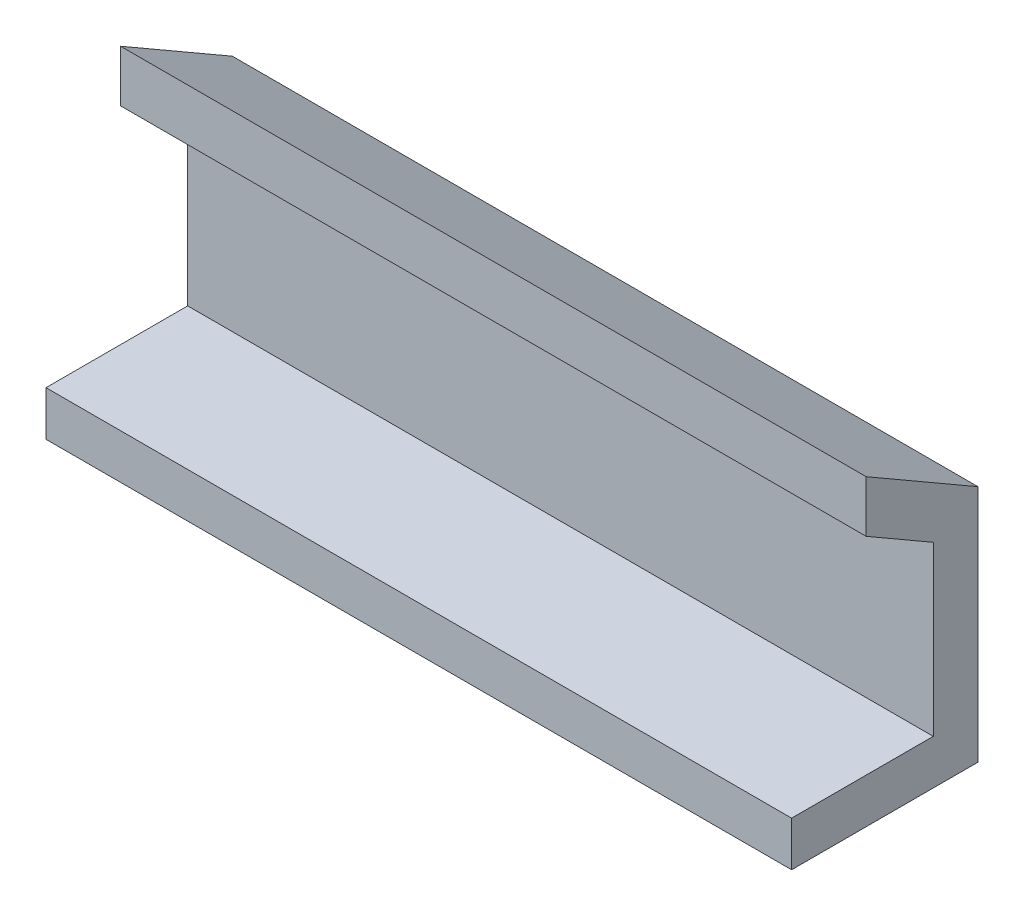
ISO-10303-21;
HEADER;
FILE_DESCRIPTION(('STEP AP214'),'2;1');
FILE_NAME('part.step','',(''),(''),'','','');
FILE_SCHEMA(('AUTOMOTIVE_DESIGN { 1 0 10303 214 1 1 1 1 }'));
ENDSEC;
DATA;
#1=APPLICATION_CONTEXT('core data for automotive mechanical design processes');
#2=APPLICATION_PROTOCOL_DEFINITION('international standard','automotive_design',2000,#1);
#3=PRODUCT_CONTEXT('',#1,'mechanical');
#4=PRODUCT('Part','Part','',(#3));
#5=PRODUCT_RELATED_PRODUCT_CATEGORY('part','',(#4));
#6=PRODUCT_DEFINITION_FORMATION('','',#4);
#7=PRODUCT_DEFINITION_CONTEXT('part definition',#1,'design');
#8=PRODUCT_DEFINITION('design','',#6,#7);
#9=PRODUCT_DEFINITION_SHAPE('','',#8);
#10=(LENGTH_UNIT() NAMED_UNIT(*) SI_UNIT(.MILLI.,.METRE.));
#11=(NAMED_UNIT(*) PLANE_ANGLE_UNIT() SI_UNIT($,.RADIAN.));
#12=(NAMED_UNIT(*) SI_UNIT($,.STERADIAN.) SOLID_ANGLE_UNIT());
#13=UNCERTAINTY_MEASURE_WITH_UNIT(LENGTH_MEASURE(1.E-05),#10,'distance_accuracy_value','');
#14=(GEOMETRIC_REPRESENTATION_CONTEXT(3) GLOBAL_UNCERTAINTY_ASSIGNED_CONTEXT((#13)) GLOBAL_UNIT_ASSIGNED_CONTEXT((#10,
#11,#12)) REPRESENTATION_CONTEXT('',''));
#15=CARTESIAN_POINT('',(0.,0.,0.));
#16=DIRECTION('',(0.,0.,1.));
#17=DIRECTION('',(1.,0.,0.));
#18=AXIS2_PLACEMENT_3D('',#15,#16,#17);
#19=CARTESIAN_POINT('',(100.,6.,0.));
#20=DIRECTION('',(0.,0.,-1.));
#21=DIRECTION('',(0.,1.,0.));
#22=AXIS2_PLACEMENT_3D('',#19,#20,#21);
#23=PLANE('',#22);
#24=DIRECTION('',(0.,-1.,0.));
#25=VECTOR('',#24,1.);
#26=CARTESIAN_POINT('',(0.,6.,0.));
#27=LINE('',#26,#25);
#28=CARTESIAN_POINT('',(0.,6.,0.));
#29=VERTEX_POINT('',#28);
#30=CARTESIAN_POINT('',(0.,0.,0.));
#31=VERTEX_POINT('',#30);
#32=EDGE_CURVE('E131',#29,#31,#27,.T.);
#33=ORIENTED_EDGE('',*,*,#32,.T.);
#34=DIRECTION('',(-1.,0.,0.));
#35=VECTOR('',#34,1.);
#36=CARTESIAN_POINT('',(100.,0.,0.));
#37=LINE('',#36,#35);
#38=CARTESIAN_POINT('',(100.,0.,0.));
#39=VERTEX_POINT('',#38);
#40=EDGE_CURVE('E11',#39,#31,#37,.T.);
#41=ORIENTED_EDGE('',*,*,#40,.F.);
#42=DIRECTION('',(0.,-1.,0.));
#43=VECTOR('',#42,1.);
#44=CARTESIAN_POINT('',(100.,6.,0.));
#45=LINE('',#44,#43);
#46=CARTESIAN_POINT('',(100.,6.,0.));
#47=VERTEX_POINT('',#46);
#48=EDGE_CURVE('E145',#47,#39,#45,.T.);
#49=ORIENTED_EDGE('',*,*,#48,.F.);
#50=DIRECTION('',(-1.,0.,0.));
#51=VECTOR('',#50,1.);
#52=CARTESIAN_POINT('',(100.,6.,0.));
#53=LINE('',#52,#51);
#54=EDGE_CURVE('E127',#47,#29,#53,.T.);
#55=ORIENTED_EDGE('',*,*,#54,.T.);
#56=EDGE_LOOP('',(#33,#41,#49,#55));
#57=FACE_BOUND('',#56,.T.);
#58=ADVANCED_FACE('F35',(#57),#23,.F.);
#59=CARTESIAN_POINT('',(100.,0.,0.));
#60=DIRECTION('',(0.,1.,0.));
#61=DIRECTION('',(0.,0.,1.));
#62=AXIS2_PLACEMENT_3D('',#59,#60,#61);
#63=PLANE('',#62);
#64=DIRECTION('',(0.,0.,-1.));
#65=VECTOR('',#64,1.);
#66=CARTESIAN_POINT('',(0.,0.,0.));
#67=LINE('',#66,#65);
#68=CARTESIAN_POINT('',(0.,0.,-25.));
#69=VERTEX_POINT('',#68);
#70=EDGE_CURVE('E134',#31,#69,#67,.T.);
#71=ORIENTED_EDGE('',*,*,#70,.T.);
#72=DIRECTION('',(-1.,0.,0.));
#73=VECTOR('',#72,1.);
#74=CARTESIAN_POINT('',(100.,0.,-25.));
#75=LINE('',#74,#73);
#76=CARTESIAN_POINT('',(100.,0.,-25.));
#77=VERTEX_POINT('',#76);
#78=EDGE_CURVE('E43',#77,#69,#75,.T.);
#79=ORIENTED_EDGE('',*,*,#78,.F.);
#80=DIRECTION('',(0.,0.,-1.));
#81=VECTOR('',#80,1.);
#82=CARTESIAN_POINT('',(100.,0.,0.));
#83=LINE('',#82,#81);
#84=EDGE_CURVE('E94',#39,#77,#83,.T.);
#85=ORIENTED_EDGE('',*,*,#84,.F.);
#86=ORIENTED_EDGE('',*,*,#40,.T.);
#87=EDGE_LOOP('',(#71,#79,#85,#86));
#88=FACE_BOUND('',#87,.T.);
#89=ADVANCED_FACE('F180',(#88),#63,.F.);
#90=CARTESIAN_POINT('',(100.,0.,-25.));
#91=DIRECTION('',(0.,0.,1.));
#92=DIRECTION('',(1.,0.,0.));
#93=AXIS2_PLACEMENT_3D('',#90,#91,#92);
#94=PLANE('',#93);
#95=DIRECTION('',(0.,1.,0.));
#96=VECTOR('',#95,1.);
#97=CARTESIAN_POINT('',(0.,0.,-25.));
#98=LINE('',#97,#96);
#99=CARTESIAN_POINT('',(0.,32.,-25.));
#100=VERTEX_POINT('',#99);
#101=EDGE_CURVE('E136',#69,#100,#98,.T.);
#102=ORIENTED_EDGE('',*,*,#101,.T.);
#103=DIRECTION('',(-1.,0.,0.));
#104=VECTOR('',#103,1.);
#105=CARTESIAN_POINT('',(100.,32.,-25.));
#106=LINE('',#105,#104);
#107=CARTESIAN_POINT('',(100.,32.,-25.));
#108=VERTEX_POINT('',#107);
#109=EDGE_CURVE('E152',#108,#100,#106,.T.);
#110=ORIENTED_EDGE('',*,*,#109,.F.);
#111=DIRECTION('',(0.,1.,0.));
#112=VECTOR('',#111,1.);
#113=CARTESIAN_POINT('',(100.,0.,-25.));
#114=LINE('',#113,#112);
#115=EDGE_CURVE('E160',#77,#108,#114,.T.);
#116=ORIENTED_EDGE('',*,*,#115,.F.);
#117=ORIENTED_EDGE('',*,*,#78,.T.);
#118=EDGE_LOOP('',(#102,#110,#116,#117));
#119=FACE_BOUND('',#118,.T.);
#120=ADVANCED_FACE('F158',(#119),#94,.F.);
#121=CARTESIAN_POINT('',(100.,32.,-25.));
#122=DIRECTION('',(0.,-0.86602540378444,0.499999999999998));
#123=DIRECTION('',(0.,-0.499999999999998,-0.86602540378444));
#124=AXIS2_PLACEMENT_3D('',#121,#122,#123);
#125=PLANE('',#124);
#126=DIRECTION('',(0.,0.499999999999998,0.86602540378444));
#127=VECTOR('',#126,1.);
#128=CARTESIAN_POINT('',(0.,32.,-25.));
#129=LINE('',#128,#127);
#130=CARTESIAN_POINT('',(0.,40.6602540378443,-10.));
#131=VERTEX_POINT('',#130);
#132=EDGE_CURVE('E138',#100,#131,#129,.T.);
#133=ORIENTED_EDGE('',*,*,#132,.T.);
#134=DIRECTION('',(-1.,0.,0.));
#135=VECTOR('',#134,1.);
#136=CARTESIAN_POINT('',(100.,40.6602540378443,-10.));
#137=LINE('',#136,#135);
#138=CARTESIAN_POINT('',(100.,40.6602540378443,-10.));
#139=VERTEX_POINT('',#138);
#140=EDGE_CURVE('E149',#139,#131,#137,.T.);
#141=ORIENTED_EDGE('',*,*,#140,.F.);
#142=DIRECTION('',(0.,0.499999999999998,0.86602540378444));
#143=VECTOR('',#142,1.);
#144=CARTESIAN_POINT('',(100.,32.,-25.));
#145=LINE('',#144,#143);
#146=EDGE_CURVE('E172',#108,#139,#145,.T.);
#147=ORIENTED_EDGE('',*,*,#146,.F.);
#148=ORIENTED_EDGE('',*,*,#109,.T.);
#149=EDGE_LOOP('',(#133,#141,#147,#148));
#150=FACE_BOUND('',#149,.T.);
#151=ADVANCED_FACE('F168',(#150),#125,.F.);
#152=CARTESIAN_POINT('',(100.,40.6602540378443,-10.));
#153=DIRECTION('',(0.,0.,-1.));
#154=DIRECTION('',(-1.,0.,0.));
#155=AXIS2_PLACEMENT_3D('',#152,#153,#154);
#156=PLANE('',#155);
#157=DIRECTION('',(0.,-1.,0.));
#158=VECTOR('',#157,1.);
#159=CARTESIAN_POINT('',(0.,40.6602540378443,-10.));
#160=LINE('',#159,#158);
#161=CARTESIAN_POINT('',(0.,33.7320508075688,-10.));
#162=VERTEX_POINT('',#161);
#163=EDGE_CURVE('E140',#131,#162,#160,.T.);
#164=ORIENTED_EDGE('',*,*,#163,.T.);
#165=DIRECTION('',(-1.,0.,0.));
#166=VECTOR('',#165,1.);
#167=CARTESIAN_POINT('',(100.,33.7320508075688,-10.));
#168=LINE('',#167,#166);
#169=CARTESIAN_POINT('',(100.,33.7320508075688,-10.));
#170=VERTEX_POINT('',#169);
#171=EDGE_CURVE('E122',#170,#162,#168,.T.);
#172=ORIENTED_EDGE('',*,*,#171,.F.);
#173=DIRECTION('',(0.,-1.,0.));
#174=VECTOR('',#173,1.);
#175=CARTESIAN_POINT('',(100.,40.6602540378443,-10.));
#176=LINE('',#175,#174);
#177=EDGE_CURVE('E113',#139,#170,#176,.T.);
#178=ORIENTED_EDGE('',*,*,#177,.F.);
#179=ORIENTED_EDGE('',*,*,#140,.T.);
#180=EDGE_LOOP('',(#164,#172,#178,#179));
#181=FACE_BOUND('',#180,.T.);
#182=ADVANCED_FACE('F171',(#181),#156,.F.);
#183=CARTESIAN_POINT('',(100.,33.7320508075688,-10.));
#184=DIRECTION('',(0.,0.86602540378444,-0.499999999999998));
#185=DIRECTION('',(0.,0.499999999999998,0.86602540378444));
#186=AXIS2_PLACEMENT_3D('',#183,#184,#185);
#187=PLANE('',#186);
#188=DIRECTION('',(0.,-0.499999999999998,-0.86602540378444));
#189=VECTOR('',#188,1.);
#190=CARTESIAN_POINT('',(0.,33.7320508075688,-10.));
#191=LINE('',#190,#189);
#192=CARTESIAN_POINT('',(0.,28.5358983848622,-19.));
#193=VERTEX_POINT('',#192);
#194=EDGE_CURVE('E121',#162,#193,#191,.T.);
#195=ORIENTED_EDGE('',*,*,#194,.T.);
#196=DIRECTION('',(-1.,0.,0.));
#197=VECTOR('',#196,1.);
#198=CARTESIAN_POINT('',(100.,28.5358983848622,-19.));
#199=LINE('',#198,#197);
#200=CARTESIAN_POINT('',(100.,28.5358983848622,-19.));
#201=VERTEX_POINT('',#200);
#202=EDGE_CURVE('E118',#201,#193,#199,.T.);
#203=ORIENTED_EDGE('',*,*,#202,.F.);
#204=DIRECTION('',(0.,-0.499999999999998,-0.86602540378444));
#205=VECTOR('',#204,1.);
#206=CARTESIAN_POINT('',(100.,33.7320508075688,-10.));
#207=LINE('',#206,#205);
#208=EDGE_CURVE('E107',#170,#201,#207,.T.);
#209=ORIENTED_EDGE('',*,*,#208,.F.);
#210=ORIENTED_EDGE('',*,*,#171,.T.);
#211=EDGE_LOOP('',(#195,#203,#209,#210));
#212=FACE_BOUND('',#211,.T.);
#213=ADVANCED_FACE('F119',(#212),#187,.F.);
#214=CARTESIAN_POINT('',(100.,28.5358983848622,-19.));
#215=DIRECTION('',(0.,0.,-1.));
#216=DIRECTION('',(0.,1.,0.));
#217=AXIS2_PLACEMENT_3D('',#214,#215,#216);
#218=PLANE('',#217);
#219=DIRECTION('',(0.,-1.,0.));
#220=VECTOR('',#219,1.);
#221=CARTESIAN_POINT('',(0.,28.5358983848622,-19.));
#222=LINE('',#221,#220);
#223=CARTESIAN_POINT('',(0.,6.,-19.));
#224=VERTEX_POINT('',#223);
#225=EDGE_CURVE('E80',#193,#224,#222,.T.);
#226=ORIENTED_EDGE('',*,*,#225,.T.);
#227=DIRECTION('',(-1.,0.,0.));
#228=VECTOR('',#227,1.);
#229=CARTESIAN_POINT('',(100.,6.,-19.));
#230=LINE('',#229,#228);
#231=CARTESIAN_POINT('',(100.,6.,-19.));
#232=VERTEX_POINT('',#231);
#233=EDGE_CURVE('E123',#232,#224,#230,.T.);
#234=ORIENTED_EDGE('',*,*,#233,.F.);
#235=DIRECTION('',(0.,-1.,0.));
#236=VECTOR('',#235,1.);
#237=CARTESIAN_POINT('',(100.,28.5358983848622,-19.));
#238=LINE('',#237,#236);
#239=EDGE_CURVE('E111',#201,#232,#238,.T.);
#240=ORIENTED_EDGE('',*,*,#239,.F.);
#241=ORIENTED_EDGE('',*,*,#202,.T.);
#242=EDGE_LOOP('',(#226,#234,#240,#241));
#243=FACE_BOUND('',#242,.T.);
#244=ADVANCED_FACE('F125',(#243),#218,.F.);
#245=CARTESIAN_POINT('',(100.,6.,-19.));
#246=DIRECTION('',(0.,-1.,0.));
#247=DIRECTION('',(0.,0.,-1.));
#248=AXIS2_PLACEMENT_3D('',#245,#246,#247);
#249=PLANE('',#248);
#250=DIRECTION('',(0.,0.,1.));
#251=VECTOR('',#250,1.);
#252=CARTESIAN_POINT('',(0.,6.,-19.));
#253=LINE('',#252,#251);
#254=EDGE_CURVE('E86',#224,#29,#253,.T.);
#255=ORIENTED_EDGE('',*,*,#254,.T.);
#256=ORIENTED_EDGE('',*,*,#54,.F.);
#257=DIRECTION('',(0.,0.,1.));
#258=VECTOR('',#257,1.);
#259=CARTESIAN_POINT('',(100.,6.,-19.));
#260=LINE('',#259,#258);
#261=EDGE_CURVE('E51',#232,#47,#260,.T.);
#262=ORIENTED_EDGE('',*,*,#261,.F.);
#263=ORIENTED_EDGE('',*,*,#233,.T.);
#264=EDGE_LOOP('',(#255,#256,#262,#263));
#265=FACE_BOUND('',#264,.T.);
#266=ADVANCED_FACE('F196',(#265),#249,.F.);
#267=CARTESIAN_POINT('',(100.,0.,0.));
#268=DIRECTION('',(1.,0.,0.));
#269=DIRECTION('',(0.,0.,-1.));
#270=AXIS2_PLACEMENT_3D('',#267,#268,#269);
#271=PLANE('',#270);
#272=ORIENTED_EDGE('',*,*,#48,.T.);
#273=ORIENTED_EDGE('',*,*,#84,.T.);
#274=ORIENTED_EDGE('',*,*,#115,.T.);
#275=ORIENTED_EDGE('',*,*,#146,.T.);
#276=ORIENTED_EDGE('',*,*,#177,.T.);
#277=ORIENTED_EDGE('',*,*,#208,.T.);
#278=ORIENTED_EDGE('',*,*,#239,.T.);
#279=ORIENTED_EDGE('',*,*,#261,.T.);
#280=EDGE_LOOP('',(#272,#273,#274,#275,#276,#277,#278,#279));
#281=FACE_BOUND('',#280,.T.);
#282=ADVANCED_FACE('F109',(#281),#271,.T.);
#283=CARTESIAN_POINT('',(0.,0.,0.));
#284=DIRECTION('',(1.,0.,0.));
#285=DIRECTION('',(0.,0.,-1.));
#286=AXIS2_PLACEMENT_3D('',#283,#284,#285);
#287=PLANE('',#286);
#288=ORIENTED_EDGE('',*,*,#32,.F.);
#289=ORIENTED_EDGE('',*,*,#254,.F.);
#290=ORIENTED_EDGE('',*,*,#225,.F.);
#291=ORIENTED_EDGE('',*,*,#194,.F.);
#292=ORIENTED_EDGE('',*,*,#163,.F.);
#293=ORIENTED_EDGE('',*,*,#132,.F.);
#294=ORIENTED_EDGE('',*,*,#101,.F.);
#295=ORIENTED_EDGE('',*,*,#70,.F.);
#296=EDGE_LOOP('',(#288,#289,#290,#291,#292,#293,#294,#295));
#297=FACE_BOUND('',#296,.T.);
#298=ADVANCED_FACE('F164',(#297),#287,.F.);
#299=CLOSED_SHELL('',(#58,#89,#120,#151,#182,#213,#244,#266,#282,#298));
#300=MANIFOLD_SOLID_BREP('B2',#299);
#301=ADVANCED_BREP_SHAPE_REPRESENTATION('',(#18,#300),#14);
#302=SHAPE_DEFINITION_REPRESENTATION(#9,#301);
ENDSEC;
END-ISO-10303-21;
